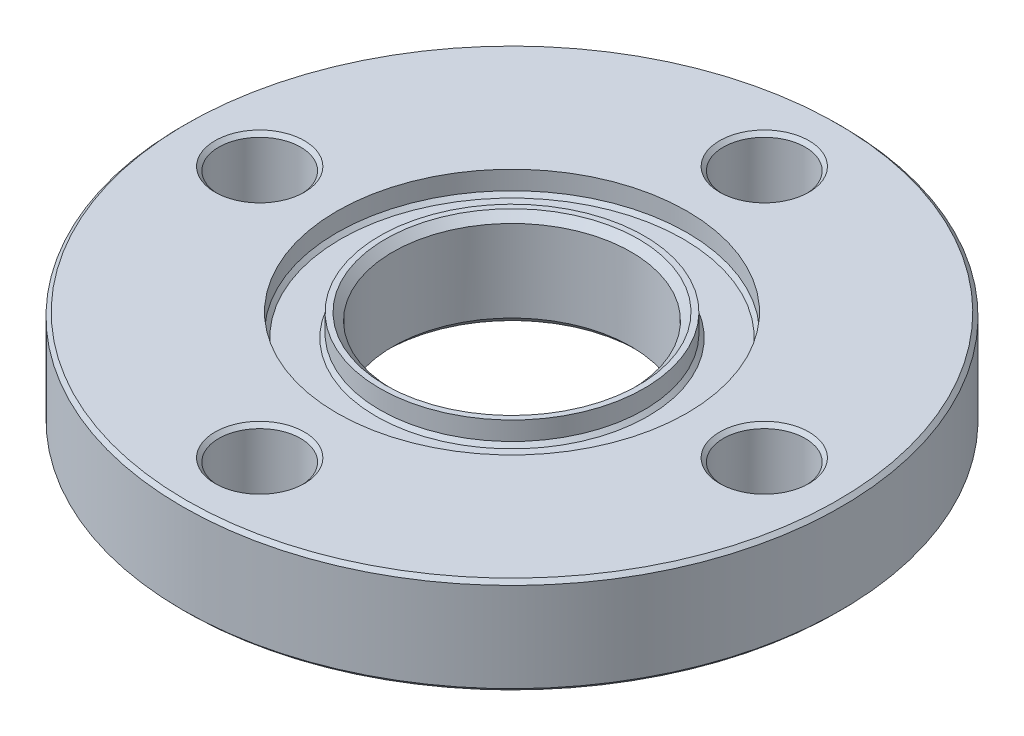
ISO-10303-21;
HEADER;
FILE_DESCRIPTION(('STEP AP214'),'2;1');
FILE_NAME('part.step','',(''),(''),'','','');
FILE_SCHEMA(('AUTOMOTIVE_DESIGN { 1 0 10303 214 1 1 1 1 }'));
ENDSEC;
DATA;
#1=APPLICATION_CONTEXT('core data for automotive mechanical design processes');
#2=APPLICATION_PROTOCOL_DEFINITION('international standard','automotive_design',2000,#1);
#3=PRODUCT_CONTEXT('',#1,'mechanical');
#4=PRODUCT('Part','Part','',(#3));
#5=PRODUCT_RELATED_PRODUCT_CATEGORY('part','',(#4));
#6=PRODUCT_DEFINITION_FORMATION('','',#4);
#7=PRODUCT_DEFINITION_CONTEXT('part definition',#1,'design');
#8=PRODUCT_DEFINITION('design','',#6,#7);
#9=PRODUCT_DEFINITION_SHAPE('','',#8);
#10=(LENGTH_UNIT() NAMED_UNIT(*) SI_UNIT(.MILLI.,.METRE.));
#11=(NAMED_UNIT(*) PLANE_ANGLE_UNIT() SI_UNIT($,.RADIAN.));
#12=(NAMED_UNIT(*) SI_UNIT($,.STERADIAN.) SOLID_ANGLE_UNIT());
#13=UNCERTAINTY_MEASURE_WITH_UNIT(LENGTH_MEASURE(1.E-05),#10,'distance_accuracy_value','');
#14=(GEOMETRIC_REPRESENTATION_CONTEXT(3) GLOBAL_UNCERTAINTY_ASSIGNED_CONTEXT((#13)) GLOBAL_UNIT_ASSIGNED_CONTEXT((#10,
#11,#12)) REPRESENTATION_CONTEXT('',''));
#15=CARTESIAN_POINT('',(0.,0.,0.));
#16=DIRECTION('',(0.,0.,1.));
#17=DIRECTION('',(1.,0.,0.));
#18=AXIS2_PLACEMENT_3D('',#15,#16,#17);
#19=CARTESIAN_POINT('',(0.,-6.5,44.25));
#20=DIRECTION('',(0.,-1.,0.));
#21=DIRECTION('',(0.,0.,-1.));
#22=AXIS2_PLACEMENT_3D('',#19,#20,#21);
#23=PLANE('',#22);
#24=CARTESIAN_POINT('',(33.875,-6.5,0.));
#25=DIRECTION('',(0.,-1.,0.));
#26=DIRECTION('',(0.,0.,-1.));
#27=AXIS2_PLACEMENT_3D('',#24,#25,#26);
#28=CIRCLE('',#27,6.00000000000002);
#29=CARTESIAN_POINT('',(33.875,-6.5,-6.00000000000002));
#30=VERTEX_POINT('',#29);
#31=EDGE_CURVE('E75',#30,#30,#28,.F.);
#32=ORIENTED_EDGE('',*,*,#31,.T.);
#33=EDGE_LOOP('',(#32));
#34=FACE_BOUND('',#33,.T.);
#35=CARTESIAN_POINT('',(0.,-6.5,-33.875));
#36=DIRECTION('',(0.,-1.,0.));
#37=DIRECTION('',(0.,0.,-1.));
#38=AXIS2_PLACEMENT_3D('',#35,#36,#37);
#39=CIRCLE('',#38,5.99999999999998);
#40=CARTESIAN_POINT('',(0.,-6.5,-39.875));
#41=VERTEX_POINT('',#40);
#42=EDGE_CURVE('E78',#41,#41,#39,.F.);
#43=ORIENTED_EDGE('',*,*,#42,.T.);
#44=EDGE_LOOP('',(#43));
#45=FACE_BOUND('',#44,.T.);
#46=CARTESIAN_POINT('',(-33.875,-6.5,0.));
#47=DIRECTION('',(0.,-1.,0.));
#48=DIRECTION('',(0.,0.,-1.));
#49=AXIS2_PLACEMENT_3D('',#46,#47,#48);
#50=CIRCLE('',#49,5.99999999999999);
#51=CARTESIAN_POINT('',(-33.875,-6.5,-5.99999999999998));
#52=VERTEX_POINT('',#51);
#53=EDGE_CURVE('E81',#52,#52,#50,.F.);
#54=ORIENTED_EDGE('',*,*,#53,.T.);
#55=EDGE_LOOP('',(#54));
#56=FACE_BOUND('',#55,.T.);
#57=CARTESIAN_POINT('',(0.,-6.5,33.875));
#58=DIRECTION('',(0.,-1.,0.));
#59=DIRECTION('',(0.,0.,-1.));
#60=AXIS2_PLACEMENT_3D('',#57,#58,#59);
#61=CIRCLE('',#60,6.00000000000001);
#62=CARTESIAN_POINT('',(0.,-6.5,27.875));
#63=VERTEX_POINT('',#62);
#64=EDGE_CURVE('E84',#63,#63,#61,.F.);
#65=ORIENTED_EDGE('',*,*,#64,.T.);
#66=EDGE_LOOP('',(#65));
#67=FACE_BOUND('',#66,.T.);
#68=CARTESIAN_POINT('',(0.,-6.5,0.));
#69=DIRECTION('',(0.,-1.,0.));
#70=DIRECTION('',(0.,0.,-1.));
#71=AXIS2_PLACEMENT_3D('',#68,#69,#70);
#72=CIRCLE('',#71,43.75);
#73=CARTESIAN_POINT('',(0.,-6.5,-43.75));
#74=VERTEX_POINT('',#73);
#75=EDGE_CURVE('E87',#74,#74,#72,.T.);
#76=ORIENTED_EDGE('',*,*,#75,.T.);
#77=EDGE_LOOP('',(#76));
#78=FACE_BOUND('',#77,.T.);
#79=CARTESIAN_POINT('',(0.,-6.5,0.));
#80=DIRECTION('',(0.,-1.,0.));
#81=DIRECTION('',(0.,0.,-1.));
#82=AXIS2_PLACEMENT_3D('',#79,#80,#81);
#83=CIRCLE('',#82,17.);
#84=CARTESIAN_POINT('',(0.,-6.5,-17.));
#85=VERTEX_POINT('',#84);
#86=EDGE_CURVE('E120',#85,#85,#83,.F.);
#87=ORIENTED_EDGE('',*,*,#86,.T.);
#88=EDGE_LOOP('',(#87));
#89=FACE_BOUND('',#88,.T.);
#90=ADVANCED_FACE('F31',(#34,#45,#56,#67,#78,#89),#23,.T.);
#91=CARTESIAN_POINT('',(0.,0.,0.));
#92=DIRECTION('',(0.,1.,0.));
#93=DIRECTION('',(0.,0.,1.));
#94=AXIS2_PLACEMENT_3D('',#91,#92,#93);
#95=CYLINDRICAL_SURFACE('',#94,16.);
#96=CARTESIAN_POINT('',(0.,-5.5,0.));
#97=DIRECTION('',(0.,-1.,0.));
#98=DIRECTION('',(0.,0.,-1.));
#99=AXIS2_PLACEMENT_3D('',#96,#97,#98);
#100=CIRCLE('',#99,16.);
#101=CARTESIAN_POINT('',(0.,-5.5,-16.));
#102=VERTEX_POINT('',#101);
#103=EDGE_CURVE('E114',#102,#102,#100,.T.);
#104=ORIENTED_EDGE('',*,*,#103,.T.);
#105=EDGE_LOOP('',(#104));
#106=FACE_BOUND('',#105,.T.);
#107=CARTESIAN_POINT('',(0.,5.49999999999996,0.));
#108=DIRECTION('',(0.,1.,0.));
#109=DIRECTION('',(0.,0.,1.));
#110=AXIS2_PLACEMENT_3D('',#107,#108,#109);
#111=CIRCLE('',#110,16.);
#112=CARTESIAN_POINT('',(0.,5.49999999999996,16.));
#113=VERTEX_POINT('',#112);
#114=EDGE_CURVE('E117',#113,#113,#111,.T.);
#115=ORIENTED_EDGE('',*,*,#114,.T.);
#116=EDGE_LOOP('',(#115));
#117=FACE_BOUND('',#116,.T.);
#118=ADVANCED_FACE('F148',(#106,#117),#95,.F.);
#119=CARTESIAN_POINT('',(0.,6.5,16.));
#120=DIRECTION('',(0.,1.,0.));
#121=DIRECTION('',(0.,0.,1.));
#122=AXIS2_PLACEMENT_3D('',#119,#120,#121);
#123=PLANE('',#122);
#124=CARTESIAN_POINT('',(0.,6.5,0.));
#125=DIRECTION('',(0.,1.,0.));
#126=DIRECTION('',(0.,0.,1.));
#127=AXIS2_PLACEMENT_3D('',#124,#125,#126);
#128=CIRCLE('',#127,17.0000000000001);
#129=CARTESIAN_POINT('',(0.,6.5,17.0000000000001));
#130=VERTEX_POINT('',#129);
#131=EDGE_CURVE('E111',#130,#130,#128,.F.);
#132=ORIENTED_EDGE('',*,*,#131,.T.);
#133=EDGE_LOOP('',(#132));
#134=FACE_BOUND('',#133,.T.);
#135=CARTESIAN_POINT('',(0.,6.5,0.));
#136=DIRECTION('',(0.,1.,0.));
#137=DIRECTION('',(0.,0.,1.));
#138=AXIS2_PLACEMENT_3D('',#135,#136,#137);
#139=CIRCLE('',#138,17.75);
#140=CARTESIAN_POINT('',(0.,6.5,17.75));
#141=VERTEX_POINT('',#140);
#142=EDGE_CURVE('E123',#141,#141,#139,.T.);
#143=ORIENTED_EDGE('',*,*,#142,.T.);
#144=EDGE_LOOP('',(#143));
#145=FACE_BOUND('',#144,.T.);
#146=ADVANCED_FACE('F154',(#134,#145),#123,.T.);
#147=CARTESIAN_POINT('',(0.,0.,0.));
#148=DIRECTION('',(0.,1.,0.));
#149=DIRECTION('',(0.,0.,1.));
#150=AXIS2_PLACEMENT_3D('',#147,#148,#149);
#151=CYLINDRICAL_SURFACE('',#150,17.75);
#152=CARTESIAN_POINT('',(0.,3.99999999999998,0.));
#153=DIRECTION('',(0.,1.,0.));
#154=DIRECTION('',(0.,0.,1.));
#155=AXIS2_PLACEMENT_3D('',#152,#153,#154);
#156=CIRCLE('',#155,17.75);
#157=CARTESIAN_POINT('',(0.,3.99999999999998,17.75));
#158=VERTEX_POINT('',#157);
#159=EDGE_CURVE('E54',#158,#158,#156,.T.);
#160=ORIENTED_EDGE('',*,*,#159,.T.);
#161=EDGE_LOOP('',(#160));
#162=FACE_BOUND('',#161,.T.);
#163=ORIENTED_EDGE('',*,*,#142,.F.);
#164=EDGE_LOOP('',(#163));
#165=FACE_BOUND('',#164,.T.);
#166=ADVANCED_FACE('F355',(#162,#165),#151,.T.);
#167=CARTESIAN_POINT('',(0.,3.5,17.75));
#168=DIRECTION('',(0.,1.,0.));
#169=DIRECTION('',(0.,0.,1.));
#170=AXIS2_PLACEMENT_3D('',#167,#168,#169);
#171=PLANE('',#170);
#172=CARTESIAN_POINT('',(0.,3.5,0.));
#173=DIRECTION('',(0.,1.,0.));
#174=DIRECTION('',(0.,0.,1.));
#175=AXIS2_PLACEMENT_3D('',#172,#173,#174);
#176=CIRCLE('',#175,18.25);
#177=CARTESIAN_POINT('',(0.,3.5,18.25));
#178=VERTEX_POINT('',#177);
#179=EDGE_CURVE('E46',#178,#178,#176,.F.);
#180=ORIENTED_EDGE('',*,*,#179,.T.);
#181=EDGE_LOOP('',(#180));
#182=FACE_BOUND('',#181,.T.);
#183=CARTESIAN_POINT('',(0.,3.5,0.));
#184=DIRECTION('',(0.,1.,0.));
#185=DIRECTION('',(0.,0.,1.));
#186=AXIS2_PLACEMENT_3D('',#183,#184,#185);
#187=CIRCLE('',#186,23.);
#188=CARTESIAN_POINT('',(0.,3.5,23.));
#189=VERTEX_POINT('',#188);
#190=EDGE_CURVE('E51',#189,#189,#187,.T.);
#191=ORIENTED_EDGE('',*,*,#190,.T.);
#192=EDGE_LOOP('',(#191));
#193=FACE_BOUND('',#192,.T.);
#194=ADVANCED_FACE('F143',(#182,#193),#171,.T.);
#195=CARTESIAN_POINT('',(0.,0.,0.));
#196=DIRECTION('',(0.,1.,0.));
#197=DIRECTION('',(0.,0.,1.));
#198=AXIS2_PLACEMENT_3D('',#195,#196,#197);
#199=CYLINDRICAL_SURFACE('',#198,23.5);
#200=CARTESIAN_POINT('',(0.,3.99999999999998,0.));
#201=DIRECTION('',(0.,1.,0.));
#202=DIRECTION('',(0.,0.,1.));
#203=AXIS2_PLACEMENT_3D('',#200,#201,#202);
#204=CIRCLE('',#203,23.5);
#205=CARTESIAN_POINT('',(0.,3.99999999999998,23.5));
#206=VERTEX_POINT('',#205);
#207=EDGE_CURVE('E42',#206,#206,#204,.F.);
#208=ORIENTED_EDGE('',*,*,#207,.T.);
#209=EDGE_LOOP('',(#208));
#210=FACE_BOUND('',#209,.T.);
#211=CARTESIAN_POINT('',(0.,6.5,0.));
#212=DIRECTION('',(0.,1.,0.));
#213=DIRECTION('',(0.,0.,1.));
#214=AXIS2_PLACEMENT_3D('',#211,#212,#213);
#215=CIRCLE('',#214,23.5);
#216=CARTESIAN_POINT('',(0.,6.5,23.5));
#217=VERTEX_POINT('',#216);
#218=EDGE_CURVE('E126',#217,#217,#215,.T.);
#219=ORIENTED_EDGE('',*,*,#218,.T.);
#220=EDGE_LOOP('',(#219));
#221=FACE_BOUND('',#220,.T.);
#222=ADVANCED_FACE('F130',(#210,#221),#199,.F.);
#223=CARTESIAN_POINT('',(0.,6.5,23.5));
#224=DIRECTION('',(0.,1.,0.));
#225=DIRECTION('',(0.,0.,1.));
#226=AXIS2_PLACEMENT_3D('',#223,#224,#225);
#227=PLANE('',#226);
#228=CARTESIAN_POINT('',(33.875,6.5,0.));
#229=DIRECTION('',(0.,1.,0.));
#230=DIRECTION('',(0.,0.,1.));
#231=AXIS2_PLACEMENT_3D('',#228,#229,#230);
#232=CIRCLE('',#231,6.00000000000002);
#233=CARTESIAN_POINT('',(33.875,6.5,6.00000000000002));
#234=VERTEX_POINT('',#233);
#235=EDGE_CURVE('E90',#234,#234,#232,.F.);
#236=ORIENTED_EDGE('',*,*,#235,.T.);
#237=EDGE_LOOP('',(#236));
#238=FACE_BOUND('',#237,.T.);
#239=CARTESIAN_POINT('',(0.,6.5,-33.875));
#240=DIRECTION('',(0.,1.,0.));
#241=DIRECTION('',(0.,0.,1.));
#242=AXIS2_PLACEMENT_3D('',#239,#240,#241);
#243=CIRCLE('',#242,6.00000000000007);
#244=CARTESIAN_POINT('',(0.,6.5,-27.8749999999999));
#245=VERTEX_POINT('',#244);
#246=EDGE_CURVE('E93',#245,#245,#243,.F.);
#247=ORIENTED_EDGE('',*,*,#246,.T.);
#248=EDGE_LOOP('',(#247));
#249=FACE_BOUND('',#248,.T.);
#250=CARTESIAN_POINT('',(-33.875,6.5,0.));
#251=DIRECTION('',(0.,1.,0.));
#252=DIRECTION('',(0.,0.,1.));
#253=AXIS2_PLACEMENT_3D('',#250,#251,#252);
#254=CIRCLE('',#253,6.00000000000007);
#255=CARTESIAN_POINT('',(-33.875,6.5,6.00000000000008));
#256=VERTEX_POINT('',#255);
#257=EDGE_CURVE('E96',#256,#256,#254,.F.);
#258=ORIENTED_EDGE('',*,*,#257,.T.);
#259=EDGE_LOOP('',(#258));
#260=FACE_BOUND('',#259,.T.);
#261=CARTESIAN_POINT('',(0.,6.5,33.875));
#262=DIRECTION('',(0.,1.,0.));
#263=DIRECTION('',(0.,0.,1.));
#264=AXIS2_PLACEMENT_3D('',#261,#262,#263);
#265=CIRCLE('',#264,6.00000000000003);
#266=CARTESIAN_POINT('',(0.,6.5,39.875));
#267=VERTEX_POINT('',#266);
#268=EDGE_CURVE('E99',#267,#267,#265,.F.);
#269=ORIENTED_EDGE('',*,*,#268,.T.);
#270=EDGE_LOOP('',(#269));
#271=FACE_BOUND('',#270,.T.);
#272=CARTESIAN_POINT('',(0.,6.5,0.));
#273=DIRECTION('',(0.,1.,0.));
#274=DIRECTION('',(0.,0.,1.));
#275=AXIS2_PLACEMENT_3D('',#272,#273,#274);
#276=CIRCLE('',#275,43.75);
#277=CARTESIAN_POINT('',(0.,6.5,43.75));
#278=VERTEX_POINT('',#277);
#279=EDGE_CURVE('E102',#278,#278,#276,.T.);
#280=ORIENTED_EDGE('',*,*,#279,.T.);
#281=EDGE_LOOP('',(#280));
#282=FACE_BOUND('',#281,.T.);
#283=ORIENTED_EDGE('',*,*,#218,.F.);
#284=EDGE_LOOP('',(#283));
#285=FACE_BOUND('',#284,.T.);
#286=ADVANCED_FACE('F132',(#238,#249,#260,#271,#282,#285),#227,.T.);
#287=CARTESIAN_POINT('',(0.,0.,0.));
#288=DIRECTION('',(0.,1.,0.));
#289=DIRECTION('',(0.,0.,1.));
#290=AXIS2_PLACEMENT_3D('',#287,#288,#289);
#291=CYLINDRICAL_SURFACE('',#290,44.25);
#292=CARTESIAN_POINT('',(0.,6.00000000000003,0.));
#293=DIRECTION('',(0.,1.,0.));
#294=DIRECTION('',(0.,0.,1.));
#295=AXIS2_PLACEMENT_3D('',#292,#293,#294);
#296=CIRCLE('',#295,44.25);
#297=CARTESIAN_POINT('',(0.,6.00000000000003,44.25));
#298=VERTEX_POINT('',#297);
#299=EDGE_CURVE('E10',#298,#298,#296,.F.);
#300=ORIENTED_EDGE('',*,*,#299,.T.);
#301=EDGE_LOOP('',(#300));
#302=FACE_BOUND('',#301,.T.);
#303=CARTESIAN_POINT('',(0.,-5.99999999999998,0.));
#304=DIRECTION('',(0.,-1.,0.));
#305=DIRECTION('',(0.,0.,-1.));
#306=AXIS2_PLACEMENT_3D('',#303,#304,#305);
#307=CIRCLE('',#306,44.25);
#308=CARTESIAN_POINT('',(0.,-5.99999999999998,-44.25));
#309=VERTEX_POINT('',#308);
#310=EDGE_CURVE('E38',#309,#309,#307,.F.);
#311=ORIENTED_EDGE('',*,*,#310,.T.);
#312=EDGE_LOOP('',(#311));
#313=FACE_BOUND('',#312,.T.);
#314=ADVANCED_FACE('F134',(#302,#313),#291,.T.);
#315=CARTESIAN_POINT('',(-33.875,-6.5,0.));
#316=DIRECTION('',(0.,1.,0.));
#317=DIRECTION('',(0.,0.,1.));
#318=AXIS2_PLACEMENT_3D('',#315,#316,#317);
#319=CYLINDRICAL_SURFACE('',#318,5.5);
#320=CARTESIAN_POINT('',(-33.875,5.99999999999994,0.));
#321=DIRECTION('',(0.,1.,0.));
#322=DIRECTION('',(0.,0.,1.));
#323=AXIS2_PLACEMENT_3D('',#320,#321,#322);
#324=CIRCLE('',#323,5.5);
#325=CARTESIAN_POINT('',(-33.875,5.99999999999994,5.50000000000001));
#326=VERTEX_POINT('',#325);
#327=EDGE_CURVE('E63',#326,#326,#324,.T.);
#328=ORIENTED_EDGE('',*,*,#327,.T.);
#329=EDGE_LOOP('',(#328));
#330=FACE_BOUND('',#329,.T.);
#331=CARTESIAN_POINT('',(-33.875,-6.00000000000002,0.));
#332=DIRECTION('',(0.,-1.,0.));
#333=DIRECTION('',(0.,0.,-1.));
#334=AXIS2_PLACEMENT_3D('',#331,#332,#333);
#335=CIRCLE('',#334,5.5);
#336=CARTESIAN_POINT('',(-33.875,-6.00000000000002,-5.5));
#337=VERTEX_POINT('',#336);
#338=EDGE_CURVE('E66',#337,#337,#335,.T.);
#339=ORIENTED_EDGE('',*,*,#338,.T.);
#340=EDGE_LOOP('',(#339));
#341=FACE_BOUND('',#340,.T.);
#342=ADVANCED_FACE('F141',(#330,#341),#319,.F.);
#343=CARTESIAN_POINT('',(0.,-6.5,33.875));
#344=DIRECTION('',(0.,1.,0.));
#345=DIRECTION('',(0.,0.,1.));
#346=AXIS2_PLACEMENT_3D('',#343,#344,#345);
#347=CYLINDRICAL_SURFACE('',#346,5.49999999999999);
#348=CARTESIAN_POINT('',(0.,5.99999999999997,33.875));
#349=DIRECTION('',(0.,1.,0.));
#350=DIRECTION('',(0.,0.,1.));
#351=AXIS2_PLACEMENT_3D('',#348,#349,#350);
#352=CIRCLE('',#351,5.49999999999999);
#353=CARTESIAN_POINT('',(0.,5.99999999999997,39.375));
#354=VERTEX_POINT('',#353);
#355=EDGE_CURVE('E57',#354,#354,#352,.T.);
#356=ORIENTED_EDGE('',*,*,#355,.T.);
#357=EDGE_LOOP('',(#356));
#358=FACE_BOUND('',#357,.T.);
#359=CARTESIAN_POINT('',(0.,-5.99999999999999,33.875));
#360=DIRECTION('',(0.,-1.,0.));
#361=DIRECTION('',(0.,0.,-1.));
#362=AXIS2_PLACEMENT_3D('',#359,#360,#361);
#363=CIRCLE('',#362,5.49999999999999);
#364=CARTESIAN_POINT('',(0.,-5.99999999999999,28.375));
#365=VERTEX_POINT('',#364);
#366=EDGE_CURVE('E60',#365,#365,#363,.T.);
#367=ORIENTED_EDGE('',*,*,#366,.T.);
#368=EDGE_LOOP('',(#367));
#369=FACE_BOUND('',#368,.T.);
#370=ADVANCED_FACE('F311',(#358,#369),#347,.F.);
#371=CARTESIAN_POINT('',(33.875,-6.5,0.));
#372=DIRECTION('',(0.,1.,0.));
#373=DIRECTION('',(0.,0.,1.));
#374=AXIS2_PLACEMENT_3D('',#371,#372,#373);
#375=CYLINDRICAL_SURFACE('',#374,5.50000000000001);
#376=CARTESIAN_POINT('',(33.875,5.99999999999997,0.));
#377=DIRECTION('',(0.,1.,0.));
#378=DIRECTION('',(0.,0.,1.));
#379=AXIS2_PLACEMENT_3D('',#376,#377,#378);
#380=CIRCLE('',#379,5.50000000000001);
#381=CARTESIAN_POINT('',(33.875,5.99999999999997,5.50000000000001));
#382=VERTEX_POINT('',#381);
#383=EDGE_CURVE('E105',#382,#382,#380,.T.);
#384=ORIENTED_EDGE('',*,*,#383,.T.);
#385=EDGE_LOOP('',(#384));
#386=FACE_BOUND('',#385,.T.);
#387=CARTESIAN_POINT('',(33.875,-6.,0.));
#388=DIRECTION('',(0.,-1.,0.));
#389=DIRECTION('',(0.,0.,-1.));
#390=AXIS2_PLACEMENT_3D('',#387,#388,#389);
#391=CIRCLE('',#390,5.50000000000001);
#392=CARTESIAN_POINT('',(33.875,-6.,-5.50000000000001));
#393=VERTEX_POINT('',#392);
#394=EDGE_CURVE('E108',#393,#393,#391,.T.);
#395=ORIENTED_EDGE('',*,*,#394,.T.);
#396=EDGE_LOOP('',(#395));
#397=FACE_BOUND('',#396,.T.);
#398=ADVANCED_FACE('F300',(#386,#397),#375,.F.);
#399=CARTESIAN_POINT('',(0.,-6.5,-33.875));
#400=DIRECTION('',(0.,1.,0.));
#401=DIRECTION('',(0.,0.,1.));
#402=AXIS2_PLACEMENT_3D('',#399,#400,#401);
#403=CYLINDRICAL_SURFACE('',#402,5.5);
#404=CARTESIAN_POINT('',(0.,5.99999999999994,-33.875));
#405=DIRECTION('',(0.,1.,0.));
#406=DIRECTION('',(0.,0.,1.));
#407=AXIS2_PLACEMENT_3D('',#404,#405,#406);
#408=CIRCLE('',#407,5.5);
#409=CARTESIAN_POINT('',(0.,5.99999999999994,-28.375));
#410=VERTEX_POINT('',#409);
#411=EDGE_CURVE('E69',#410,#410,#408,.T.);
#412=ORIENTED_EDGE('',*,*,#411,.T.);
#413=EDGE_LOOP('',(#412));
#414=FACE_BOUND('',#413,.T.);
#415=CARTESIAN_POINT('',(0.,-6.00000000000002,-33.875));
#416=DIRECTION('',(0.,-1.,0.));
#417=DIRECTION('',(0.,0.,-1.));
#418=AXIS2_PLACEMENT_3D('',#415,#416,#417);
#419=CIRCLE('',#418,5.5);
#420=CARTESIAN_POINT('',(0.,-6.00000000000002,-39.375));
#421=VERTEX_POINT('',#420);
#422=EDGE_CURVE('E72',#421,#421,#419,.T.);
#423=ORIENTED_EDGE('',*,*,#422,.T.);
#424=EDGE_LOOP('',(#423));
#425=FACE_BOUND('',#424,.T.);
#426=ADVANCED_FACE('F164',(#414,#425),#403,.F.);
#427=CARTESIAN_POINT('',(0.,-6.5,0.));
#428=DIRECTION('',(0.,-1.,0.));
#429=DIRECTION('',(0.,0.,-1.));
#430=AXIS2_PLACEMENT_3D('',#427,#428,#429);
#431=CONICAL_SURFACE('',#430,17.,0.785398163397448);
#432=ORIENTED_EDGE('',*,*,#103,.F.);
#433=EDGE_LOOP('',(#432));
#434=FACE_BOUND('',#433,.T.);
#435=ORIENTED_EDGE('',*,*,#86,.F.);
#436=EDGE_LOOP('',(#435));
#437=FACE_BOUND('',#436,.T.);
#438=ADVANCED_FACE('F160',(#434,#437),#431,.F.);
#439=CARTESIAN_POINT('',(0.,5.49999999999996,0.));
#440=DIRECTION('',(0.,1.,0.));
#441=DIRECTION('',(0.,0.,1.));
#442=AXIS2_PLACEMENT_3D('',#439,#440,#441);
#443=CONICAL_SURFACE('',#442,16.,0.785398163397455);
#444=ORIENTED_EDGE('',*,*,#131,.F.);
#445=EDGE_LOOP('',(#444));
#446=FACE_BOUND('',#445,.T.);
#447=ORIENTED_EDGE('',*,*,#114,.F.);
#448=EDGE_LOOP('',(#447));
#449=FACE_BOUND('',#448,.T.);
#450=ADVANCED_FACE('F163',(#446,#449),#443,.F.);
#451=CARTESIAN_POINT('',(33.875,5.99999999999997,0.));
#452=DIRECTION('',(0.,1.,0.));
#453=DIRECTION('',(0.,0.,1.));
#454=AXIS2_PLACEMENT_3D('',#451,#452,#453);
#455=CONICAL_SURFACE('',#454,5.50000000000001,0.785398163397428);
#456=ORIENTED_EDGE('',*,*,#235,.F.);
#457=EDGE_LOOP('',(#456));
#458=FACE_BOUND('',#457,.T.);
#459=ORIENTED_EDGE('',*,*,#383,.F.);
#460=EDGE_LOOP('',(#459));
#461=FACE_BOUND('',#460,.T.);
#462=ADVANCED_FACE('F168',(#458,#461),#455,.F.);
#463=CARTESIAN_POINT('',(33.875,-6.5,0.));
#464=DIRECTION('',(0.,-1.,0.));
#465=DIRECTION('',(0.,0.,-1.));
#466=AXIS2_PLACEMENT_3D('',#463,#464,#465);
#467=CONICAL_SURFACE('',#466,6.00000000000002,0.785398163397454);
#468=ORIENTED_EDGE('',*,*,#394,.F.);
#469=EDGE_LOOP('',(#468));
#470=FACE_BOUND('',#469,.T.);
#471=ORIENTED_EDGE('',*,*,#31,.F.);
#472=EDGE_LOOP('',(#471));
#473=FACE_BOUND('',#472,.T.);
#474=ADVANCED_FACE('F172',(#470,#473),#467,.F.);
#475=CARTESIAN_POINT('',(0.,5.99999999999994,-33.875));
#476=DIRECTION('',(0.,1.,0.));
#477=DIRECTION('',(0.,0.,1.));
#478=AXIS2_PLACEMENT_3D('',#475,#476,#477);
#479=CONICAL_SURFACE('',#478,5.5,0.785398163397458);
#480=ORIENTED_EDGE('',*,*,#246,.F.);
#481=EDGE_LOOP('',(#480));
#482=FACE_BOUND('',#481,.T.);
#483=ORIENTED_EDGE('',*,*,#411,.F.);
#484=EDGE_LOOP('',(#483));
#485=FACE_BOUND('',#484,.T.);
#486=ADVANCED_FACE('F176',(#482,#485),#479,.F.);
#487=CARTESIAN_POINT('',(0.,-6.5,-33.875));
#488=DIRECTION('',(0.,-1.,0.));
#489=DIRECTION('',(0.,0.,-1.));
#490=AXIS2_PLACEMENT_3D('',#487,#488,#489);
#491=CONICAL_SURFACE('',#490,5.99999999999998,0.785398163397443);
#492=ORIENTED_EDGE('',*,*,#422,.F.);
#493=EDGE_LOOP('',(#492));
#494=FACE_BOUND('',#493,.T.);
#495=ORIENTED_EDGE('',*,*,#42,.F.);
#496=EDGE_LOOP('',(#495));
#497=FACE_BOUND('',#496,.T.);
#498=ADVANCED_FACE('F180',(#494,#497),#491,.F.);
#499=CARTESIAN_POINT('',(-33.875,5.99999999999994,0.));
#500=DIRECTION('',(0.,1.,0.));
#501=DIRECTION('',(0.,0.,1.));
#502=AXIS2_PLACEMENT_3D('',#499,#500,#501);
#503=CONICAL_SURFACE('',#502,5.5,0.785398163397457);
#504=ORIENTED_EDGE('',*,*,#257,.F.);
#505=EDGE_LOOP('',(#504));
#506=FACE_BOUND('',#505,.T.);
#507=ORIENTED_EDGE('',*,*,#327,.F.);
#508=EDGE_LOOP('',(#507));
#509=FACE_BOUND('',#508,.T.);
#510=ADVANCED_FACE('F184',(#506,#509),#503,.F.);
#511=CARTESIAN_POINT('',(-33.875,-6.5,0.));
#512=DIRECTION('',(0.,-1.,0.));
#513=DIRECTION('',(0.,0.,-1.));
#514=AXIS2_PLACEMENT_3D('',#511,#512,#513);
#515=CONICAL_SURFACE('',#514,5.99999999999999,0.785398163397453);
#516=ORIENTED_EDGE('',*,*,#338,.F.);
#517=EDGE_LOOP('',(#516));
#518=FACE_BOUND('',#517,.T.);
#519=ORIENTED_EDGE('',*,*,#53,.F.);
#520=EDGE_LOOP('',(#519));
#521=FACE_BOUND('',#520,.T.);
#522=ADVANCED_FACE('F188',(#518,#521),#515,.F.);
#523=CARTESIAN_POINT('',(0.,5.99999999999997,33.875));
#524=DIRECTION('',(0.,1.,0.));
#525=DIRECTION('',(0.,0.,1.));
#526=AXIS2_PLACEMENT_3D('',#523,#524,#525);
#527=CONICAL_SURFACE('',#526,5.49999999999999,0.785398163397457);
#528=ORIENTED_EDGE('',*,*,#268,.F.);
#529=EDGE_LOOP('',(#528));
#530=FACE_BOUND('',#529,.T.);
#531=ORIENTED_EDGE('',*,*,#355,.F.);
#532=EDGE_LOOP('',(#531));
#533=FACE_BOUND('',#532,.T.);
#534=ADVANCED_FACE('F192',(#530,#533),#527,.F.);
#535=CARTESIAN_POINT('',(0.,-6.5,33.875));
#536=DIRECTION('',(0.,-1.,0.));
#537=DIRECTION('',(0.,0.,-1.));
#538=AXIS2_PLACEMENT_3D('',#535,#536,#537);
#539=CONICAL_SURFACE('',#538,6.00000000000001,0.78539816339745);
#540=ORIENTED_EDGE('',*,*,#366,.F.);
#541=EDGE_LOOP('',(#540));
#542=FACE_BOUND('',#541,.T.);
#543=ORIENTED_EDGE('',*,*,#64,.F.);
#544=EDGE_LOOP('',(#543));
#545=FACE_BOUND('',#544,.T.);
#546=ADVANCED_FACE('F196',(#542,#545),#539,.F.);
#547=CARTESIAN_POINT('',(0.,3.99999999999998,0.));
#548=DIRECTION('',(0.,-1.,0.));
#549=DIRECTION('',(0.,0.,-1.));
#550=AXIS2_PLACEMENT_3D('',#547,#548,#549);
#551=CONICAL_SURFACE('',#550,17.75,0.785398163397452);
#552=ORIENTED_EDGE('',*,*,#179,.F.);
#553=EDGE_LOOP('',(#552));
#554=FACE_BOUND('',#553,.T.);
#555=ORIENTED_EDGE('',*,*,#159,.F.);
#556=EDGE_LOOP('',(#555));
#557=FACE_BOUND('',#556,.T.);
#558=ADVANCED_FACE('F200',(#554,#557),#551,.T.);
#559=CARTESIAN_POINT('',(0.,3.5,0.));
#560=DIRECTION('',(0.,1.,0.));
#561=DIRECTION('',(0.,0.,1.));
#562=AXIS2_PLACEMENT_3D('',#559,#560,#561);
#563=CONICAL_SURFACE('',#562,23.,0.785398163397452);
#564=ORIENTED_EDGE('',*,*,#207,.F.);
#565=EDGE_LOOP('',(#564));
#566=FACE_BOUND('',#565,.T.);
#567=ORIENTED_EDGE('',*,*,#190,.F.);
#568=EDGE_LOOP('',(#567));
#569=FACE_BOUND('',#568,.T.);
#570=ADVANCED_FACE('F204',(#566,#569),#563,.F.);
#571=CARTESIAN_POINT('',(0.,6.5,0.));
#572=DIRECTION('',(0.,-1.,0.));
#573=DIRECTION('',(0.,0.,-1.));
#574=AXIS2_PLACEMENT_3D('',#571,#572,#573);
#575=CONICAL_SURFACE('',#574,43.75,0.785398163397441);
#576=ORIENTED_EDGE('',*,*,#299,.F.);
#577=EDGE_LOOP('',(#576));
#578=FACE_BOUND('',#577,.T.);
#579=ORIENTED_EDGE('',*,*,#279,.F.);
#580=EDGE_LOOP('',(#579));
#581=FACE_BOUND('',#580,.T.);
#582=ADVANCED_FACE('F207',(#578,#581),#575,.T.);
#583=CARTESIAN_POINT('',(0.,-5.99999999999998,0.));
#584=DIRECTION('',(0.,1.,0.));
#585=DIRECTION('',(0.,0.,1.));
#586=AXIS2_PLACEMENT_3D('',#583,#584,#585);
#587=CONICAL_SURFACE('',#586,44.25,0.785398163397462);
#588=ORIENTED_EDGE('',*,*,#75,.F.);
#589=EDGE_LOOP('',(#588));
#590=FACE_BOUND('',#589,.T.);
#591=ORIENTED_EDGE('',*,*,#310,.F.);
#592=EDGE_LOOP('',(#591));
#593=FACE_BOUND('',#592,.T.);
#594=ADVANCED_FACE('F33',(#590,#593),#587,.T.);
#595=CLOSED_SHELL('',(#90,#118,#146,#166,#194,#222,#286,#314,#342,#370,#398,#426,#438,#450,#462,
#474,#486,#498,#510,#522,#534,#546,#558,#570,#582,#594));
#596=MANIFOLD_SOLID_BREP('B2',#595);
#597=ADVANCED_BREP_SHAPE_REPRESENTATION('',(#18,#596),#14);
#598=SHAPE_DEFINITION_REPRESENTATION(#9,#597);
ENDSEC;
END-ISO-10303-21;
